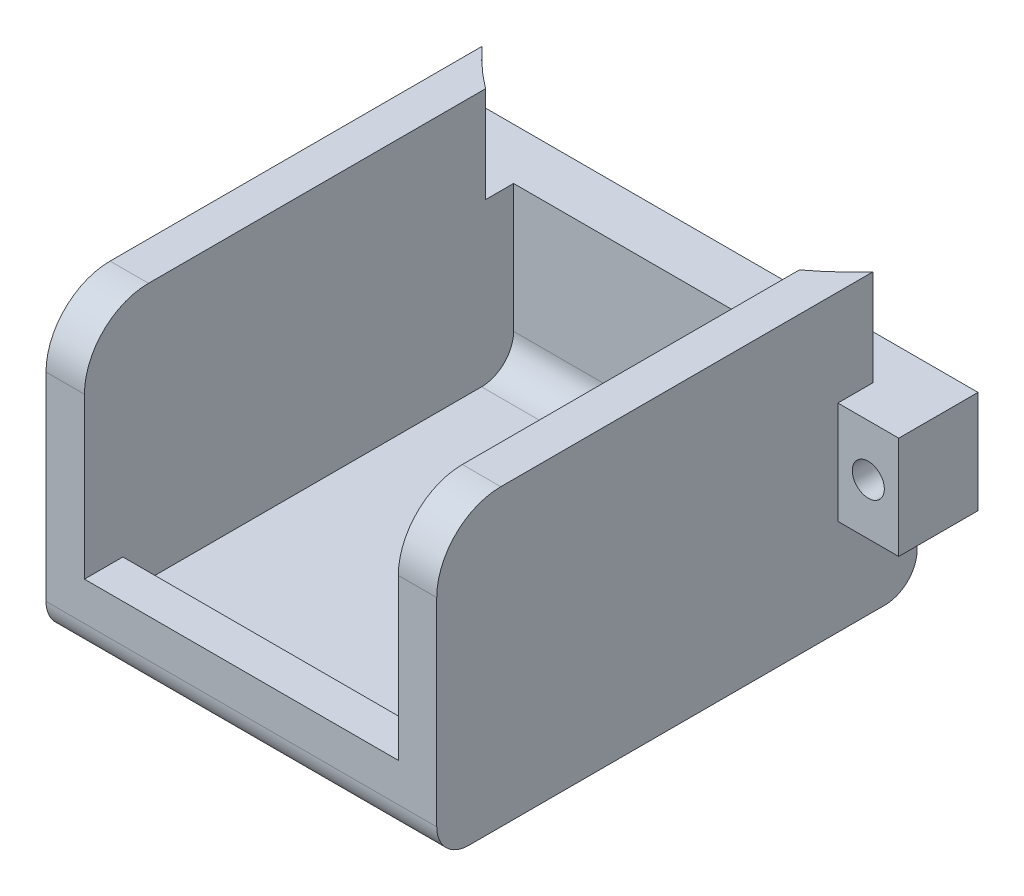
ISO-10303-21;
HEADER;
FILE_DESCRIPTION(('STEP AP214'),'2;1');
FILE_NAME('part.step','',(''),(''),'','','');
FILE_SCHEMA(('AUTOMOTIVE_DESIGN { 1 0 10303 214 1 1 1 1 }'));
ENDSEC;
DATA;
#1=APPLICATION_CONTEXT('core data for automotive mechanical design processes');
#2=APPLICATION_PROTOCOL_DEFINITION('international standard','automotive_design',2000,#1);
#3=PRODUCT_CONTEXT('',#1,'mechanical');
#4=PRODUCT('Part','Part','',(#3));
#5=PRODUCT_RELATED_PRODUCT_CATEGORY('part','',(#4));
#6=PRODUCT_DEFINITION_FORMATION('','',#4);
#7=PRODUCT_DEFINITION_CONTEXT('part definition',#1,'design');
#8=PRODUCT_DEFINITION('design','',#6,#7);
#9=PRODUCT_DEFINITION_SHAPE('','',#8);
#10=(LENGTH_UNIT() NAMED_UNIT(*) SI_UNIT(.MILLI.,.METRE.));
#11=(NAMED_UNIT(*) PLANE_ANGLE_UNIT() SI_UNIT($,.RADIAN.));
#12=(NAMED_UNIT(*) SI_UNIT($,.STERADIAN.) SOLID_ANGLE_UNIT());
#13=UNCERTAINTY_MEASURE_WITH_UNIT(LENGTH_MEASURE(1.E-05),#10,'distance_accuracy_value','');
#14=(GEOMETRIC_REPRESENTATION_CONTEXT(3) GLOBAL_UNCERTAINTY_ASSIGNED_CONTEXT((#13)) GLOBAL_UNIT_ASSIGNED_CONTEXT((#10,
#11,#12)) REPRESENTATION_CONTEXT('',''));
#15=CARTESIAN_POINT('',(0.,0.,0.));
#16=DIRECTION('',(0.,0.,1.));
#17=DIRECTION('',(1.,0.,0.));
#18=AXIS2_PLACEMENT_3D('',#15,#16,#17);
#19=CARTESIAN_POINT('',(0.,0.,0.));
#20=DIRECTION('',(0.,1.,0.));
#21=DIRECTION('',(0.,0.,1.));
#22=AXIS2_PLACEMENT_3D('',#19,#20,#21);
#23=PLANE('',#22);
#24=DIRECTION('',(0.,0.,-1.));
#25=VECTOR('',#24,1.);
#26=CARTESIAN_POINT('',(-40.,0.,0.));
#27=LINE('',#26,#25);
#28=CARTESIAN_POINT('',(-40.,0.,32.8747623565555));
#29=VERTEX_POINT('',#28);
#30=CARTESIAN_POINT('',(-40.,0.,20.5));
#31=VERTEX_POINT('',#30);
#32=EDGE_CURVE('E239',#29,#31,#27,.T.);
#33=ORIENTED_EDGE('',*,*,#32,.T.);
#34=DIRECTION('',(1.,0.,0.));
#35=VECTOR('',#34,1.);
#36=CARTESIAN_POINT('',(0.,0.,20.5));
#37=LINE('',#36,#35);
#38=CARTESIAN_POINT('',(-30.5,0.,20.5));
#39=VERTEX_POINT('',#38);
#40=EDGE_CURVE('E51',#31,#39,#37,.T.);
#41=ORIENTED_EDGE('',*,*,#40,.T.);
#42=DIRECTION('',(0.,0.,1.));
#43=VECTOR('',#42,1.);
#44=CARTESIAN_POINT('',(-30.5,0.,0.));
#45=LINE('',#44,#43);
#46=CARTESIAN_POINT('',(-30.5,0.,32.8747623565555));
#47=VERTEX_POINT('',#46);
#48=EDGE_CURVE('E322',#39,#47,#45,.T.);
#49=ORIENTED_EDGE('',*,*,#48,.T.);
#50=DIRECTION('',(-1.,0.,0.));
#51=VECTOR('',#50,1.);
#52=CARTESIAN_POINT('',(-24.5,0.,32.8747623565555));
#53=LINE('',#52,#51);
#54=EDGE_CURVE('E397',#47,#29,#53,.T.);
#55=ORIENTED_EDGE('',*,*,#54,.T.);
#56=EDGE_LOOP('',(#33,#41,#49,#55));
#57=FACE_BOUND('',#56,.T.);
#58=ADVANCED_FACE('F35',(#57),#23,.F.);
#59=CARTESIAN_POINT('',(30.5,31.,95.5));
#60=DIRECTION('',(1.,0.,0.));
#61=DIRECTION('',(0.,0.,-1.));
#62=AXIS2_PLACEMENT_3D('',#59,#60,#61);
#63=PLANE('',#62);
#64=DIRECTION('',(0.,-1.,0.));
#65=VECTOR('',#64,1.);
#66=CARTESIAN_POINT('',(30.5,31.,32.8747623565555));
#67=LINE('',#66,#65);
#68=CARTESIAN_POINT('',(30.5,16.,32.8747623565555));
#69=VERTEX_POINT('',#68);
#70=CARTESIAN_POINT('',(30.5,0.,32.8747623565555));
#71=VERTEX_POINT('',#70);
#72=EDGE_CURVE('E248',#69,#71,#67,.T.);
#73=ORIENTED_EDGE('',*,*,#72,.F.);
#74=DIRECTION('',(0.,0.,-1.));
#75=VECTOR('',#74,1.);
#76=CARTESIAN_POINT('',(30.5,16.,95.5));
#77=LINE('',#76,#75);
#78=CARTESIAN_POINT('',(30.5,16.,27.3998175176405));
#79=VERTEX_POINT('',#78);
#80=EDGE_CURVE('E243',#69,#79,#77,.T.);
#81=ORIENTED_EDGE('',*,*,#80,.T.);
#82=DIRECTION('',(0.,-1.,0.));
#83=VECTOR('',#82,1.);
#84=CARTESIAN_POINT('',(30.5,31.001,27.3998175176405));
#85=LINE('',#84,#83);
#86=CARTESIAN_POINT('',(30.5,31.,27.3998175176405));
#87=VERTEX_POINT('',#86);
#88=EDGE_CURVE('E259',#87,#79,#85,.T.);
#89=ORIENTED_EDGE('',*,*,#88,.F.);
#90=DIRECTION('',(0.,0.,-1.));
#91=VECTOR('',#90,1.);
#92=CARTESIAN_POINT('',(30.5,31.,95.5));
#93=LINE('',#92,#91);
#94=CARTESIAN_POINT('',(30.5,31.,85.5));
#95=VERTEX_POINT('',#94);
#96=EDGE_CURVE('E319',#95,#87,#93,.T.);
#97=ORIENTED_EDGE('',*,*,#96,.F.);
#98=CARTESIAN_POINT('',(30.5,21.,85.5));
#99=DIRECTION('',(1.,0.,0.));
#100=DIRECTION('',(0.,0.,-1.));
#101=AXIS2_PLACEMENT_3D('',#98,#99,#100);
#102=CIRCLE('',#101,10.);
#103=CARTESIAN_POINT('',(30.5,21.,95.5));
#104=VERTEX_POINT('',#103);
#105=EDGE_CURVE('E341',#95,#104,#102,.T.);
#106=ORIENTED_EDGE('',*,*,#105,.T.);
#107=DIRECTION('',(0.,-1.,0.));
#108=VECTOR('',#107,1.);
#109=CARTESIAN_POINT('',(30.5,31.,95.5));
#110=LINE('',#109,#108);
#111=CARTESIAN_POINT('',(30.5,-9.99999999999999,95.5));
#112=VERTEX_POINT('',#111);
#113=EDGE_CURVE('E309',#104,#112,#110,.T.);
#114=ORIENTED_EDGE('',*,*,#113,.T.);
#115=CARTESIAN_POINT('',(30.5,-10.,90.5));
#116=DIRECTION('',(1.,0.,0.));
#117=DIRECTION('',(0.,0.,-1.));
#118=AXIS2_PLACEMENT_3D('',#115,#116,#117);
#119=CIRCLE('',#118,5.);
#120=CARTESIAN_POINT('',(30.5,-15.,90.5));
#121=VERTEX_POINT('',#120);
#122=EDGE_CURVE('E381',#112,#121,#119,.T.);
#123=ORIENTED_EDGE('',*,*,#122,.T.);
#124=DIRECTION('',(0.,0.,-1.));
#125=VECTOR('',#124,1.);
#126=CARTESIAN_POINT('',(30.5,-15.,95.5));
#127=LINE('',#126,#125);
#128=CARTESIAN_POINT('',(30.5,-15.,25.5));
#129=VERTEX_POINT('',#128);
#130=EDGE_CURVE('E315',#121,#129,#127,.T.);
#131=ORIENTED_EDGE('',*,*,#130,.T.);
#132=CARTESIAN_POINT('',(30.5,-10.,25.5));
#133=DIRECTION('',(1.,0.,0.));
#134=DIRECTION('',(0.,0.,-1.));
#135=AXIS2_PLACEMENT_3D('',#132,#133,#134);
#136=CIRCLE('',#135,5.);
#137=CARTESIAN_POINT('',(30.5,-9.99999999999999,20.5));
#138=VERTEX_POINT('',#137);
#139=EDGE_CURVE('E379',#129,#138,#136,.T.);
#140=ORIENTED_EDGE('',*,*,#139,.T.);
#141=DIRECTION('',(0.,-1.,0.));
#142=VECTOR('',#141,1.);
#143=CARTESIAN_POINT('',(30.5,31.,20.5));
#144=LINE('',#143,#142);
#145=CARTESIAN_POINT('',(30.5,0.,20.5));
#146=VERTEX_POINT('',#145);
#147=EDGE_CURVE('E302',#146,#138,#144,.T.);
#148=ORIENTED_EDGE('',*,*,#147,.F.);
#149=DIRECTION('',(0.,0.,-1.));
#150=VECTOR('',#149,1.);
#151=CARTESIAN_POINT('',(30.5,0.,0.));
#152=LINE('',#151,#150);
#153=EDGE_CURVE('E332',#71,#146,#152,.T.);
#154=ORIENTED_EDGE('',*,*,#153,.F.);
#155=EDGE_LOOP('',(#73,#81,#89,#97,#106,#114,#123,#131,#140,#148,#154));
#156=FACE_BOUND('',#155,.T.);
#157=ADVANCED_FACE('F421',(#156),#63,.T.);
#158=CARTESIAN_POINT('',(-30.5,31.,95.5));
#159=DIRECTION('',(-1.,0.,0.));
#160=DIRECTION('',(0.,0.,1.));
#161=AXIS2_PLACEMENT_3D('',#158,#159,#160);
#162=PLANE('',#161);
#163=DIRECTION('',(0.,-1.,0.));
#164=VECTOR('',#163,1.);
#165=CARTESIAN_POINT('',(-30.5,31.001,27.3998175176405));
#166=LINE('',#165,#164);
#167=CARTESIAN_POINT('',(-30.5,16.,27.3998175176405));
#168=VERTEX_POINT('',#167);
#169=CARTESIAN_POINT('',(-30.5,31.,27.3998175176405));
#170=VERTEX_POINT('',#169);
#171=EDGE_CURVE('E257',#168,#170,#166,.F.);
#172=ORIENTED_EDGE('',*,*,#171,.F.);
#173=DIRECTION('',(0.,0.,1.));
#174=VECTOR('',#173,1.);
#175=CARTESIAN_POINT('',(-30.5,16.,95.5));
#176=LINE('',#175,#174);
#177=CARTESIAN_POINT('',(-30.5,16.,32.8747623565555));
#178=VERTEX_POINT('',#177);
#179=EDGE_CURVE('E241',#168,#178,#176,.T.);
#180=ORIENTED_EDGE('',*,*,#179,.T.);
#181=DIRECTION('',(0.,1.,0.));
#182=VECTOR('',#181,1.);
#183=CARTESIAN_POINT('',(-30.5,31.,32.8747623565555));
#184=LINE('',#183,#182);
#185=EDGE_CURVE('E245',#47,#178,#184,.T.);
#186=ORIENTED_EDGE('',*,*,#185,.F.);
#187=ORIENTED_EDGE('',*,*,#48,.F.);
#188=DIRECTION('',(0.,1.,0.));
#189=VECTOR('',#188,1.);
#190=CARTESIAN_POINT('',(-30.5,31.,20.5));
#191=LINE('',#190,#189);
#192=CARTESIAN_POINT('',(-30.5,-9.99999999999999,20.5));
#193=VERTEX_POINT('',#192);
#194=EDGE_CURVE('E313',#193,#39,#191,.T.);
#195=ORIENTED_EDGE('',*,*,#194,.F.);
#196=CARTESIAN_POINT('',(-30.5,-10.,25.5));
#197=DIRECTION('',(-1.,0.,0.));
#198=DIRECTION('',(0.,0.,1.));
#199=AXIS2_PLACEMENT_3D('',#196,#197,#198);
#200=CIRCLE('',#199,5.);
#201=CARTESIAN_POINT('',(-30.5,-15.,25.5));
#202=VERTEX_POINT('',#201);
#203=EDGE_CURVE('E373',#193,#202,#200,.T.);
#204=ORIENTED_EDGE('',*,*,#203,.T.);
#205=DIRECTION('',(0.,0.,-1.));
#206=VECTOR('',#205,1.);
#207=CARTESIAN_POINT('',(-30.5,-15.,95.5));
#208=LINE('',#207,#206);
#209=CARTESIAN_POINT('',(-30.5,-15.,90.5));
#210=VERTEX_POINT('',#209);
#211=EDGE_CURVE('E326',#210,#202,#208,.T.);
#212=ORIENTED_EDGE('',*,*,#211,.F.);
#213=CARTESIAN_POINT('',(-30.5,-10.,90.5));
#214=DIRECTION('',(-1.,0.,0.));
#215=DIRECTION('',(0.,0.,1.));
#216=AXIS2_PLACEMENT_3D('',#213,#214,#215);
#217=CIRCLE('',#216,5.);
#218=CARTESIAN_POINT('',(-30.5,-9.99999999999999,95.5));
#219=VERTEX_POINT('',#218);
#220=EDGE_CURVE('E375',#210,#219,#217,.T.);
#221=ORIENTED_EDGE('',*,*,#220,.T.);
#222=DIRECTION('',(0.,1.,0.));
#223=VECTOR('',#222,1.);
#224=CARTESIAN_POINT('',(-30.5,31.,95.5));
#225=LINE('',#224,#223);
#226=CARTESIAN_POINT('',(-30.5,21.,95.5));
#227=VERTEX_POINT('',#226);
#228=EDGE_CURVE('E312',#219,#227,#225,.T.);
#229=ORIENTED_EDGE('',*,*,#228,.T.);
#230=CARTESIAN_POINT('',(-30.5,21.,85.5));
#231=DIRECTION('',(-1.,0.,0.));
#232=DIRECTION('',(0.,0.,1.));
#233=AXIS2_PLACEMENT_3D('',#230,#231,#232);
#234=CIRCLE('',#233,10.);
#235=CARTESIAN_POINT('',(-30.5,31.,85.5));
#236=VERTEX_POINT('',#235);
#237=EDGE_CURVE('E352',#227,#236,#234,.T.);
#238=ORIENTED_EDGE('',*,*,#237,.T.);
#239=DIRECTION('',(0.,0.,-1.));
#240=VECTOR('',#239,1.);
#241=CARTESIAN_POINT('',(-30.5,31.,95.5));
#242=LINE('',#241,#240);
#243=EDGE_CURVE('E323',#236,#170,#242,.T.);
#244=ORIENTED_EDGE('',*,*,#243,.T.);
#245=EDGE_LOOP('',(#172,#180,#186,#187,#195,#204,#212,#221,#229,#238,#244));
#246=FACE_BOUND('',#245,.T.);
#247=ADVANCED_FACE('F392',(#246),#162,.T.);
#248=CARTESIAN_POINT('',(20.5,0.,20.5));
#249=DIRECTION('',(0.,0.,1.));
#250=DIRECTION('',(1.,0.,0.));
#251=AXIS2_PLACEMENT_3D('',#248,#249,#250);
#252=PLANE('',#251);
#253=ORIENTED_EDGE('',*,*,#194,.T.);
#254=ORIENTED_EDGE('',*,*,#40,.F.);
#255=DIRECTION('',(0.,-1.,0.));
#256=VECTOR('',#255,1.);
#257=CARTESIAN_POINT('',(-40.,31.,20.5));
#258=LINE('',#257,#256);
#259=CARTESIAN_POINT('',(-40.,16.,20.5));
#260=VERTEX_POINT('',#259);
#261=EDGE_CURVE('E210',#260,#31,#258,.T.);
#262=ORIENTED_EDGE('',*,*,#261,.F.);
#263=DIRECTION('',(1.,0.,0.));
#264=VECTOR('',#263,1.);
#265=CARTESIAN_POINT('',(0.,16.,20.5));
#266=LINE('',#265,#264);
#267=CARTESIAN_POINT('',(40.,16.,20.5));
#268=VERTEX_POINT('',#267);
#269=EDGE_CURVE('E57',#260,#268,#266,.T.);
#270=ORIENTED_EDGE('',*,*,#269,.T.);
#271=DIRECTION('',(0.,-1.,0.));
#272=VECTOR('',#271,1.);
#273=CARTESIAN_POINT('',(40.,31.,20.5));
#274=LINE('',#273,#272);
#275=CARTESIAN_POINT('',(40.,0.,20.5));
#276=VERTEX_POINT('',#275);
#277=EDGE_CURVE('E216',#268,#276,#274,.T.);
#278=ORIENTED_EDGE('',*,*,#277,.T.);
#279=EDGE_CURVE('E398',#146,#276,#37,.T.);
#280=ORIENTED_EDGE('',*,*,#279,.F.);
#281=ORIENTED_EDGE('',*,*,#147,.T.);
#282=DIRECTION('',(-1.,0.,0.));
#283=VECTOR('',#282,1.);
#284=CARTESIAN_POINT('',(-30.5,-10.,20.5));
#285=LINE('',#284,#283);
#286=EDGE_CURVE('E44',#138,#193,#285,.T.);
#287=ORIENTED_EDGE('',*,*,#286,.T.);
#288=EDGE_LOOP('',(#253,#254,#262,#270,#278,#280,#281,#287));
#289=FACE_BOUND('',#288,.T.);
#290=CARTESIAN_POINT('',(-35.25,8.,20.5));
#291=DIRECTION('',(0.,0.,1.));
#292=DIRECTION('',(1.,0.,0.));
#293=AXIS2_PLACEMENT_3D('',#290,#291,#292);
#294=CIRCLE('',#293,2.49999999999999);
#295=CARTESIAN_POINT('',(-32.75,8.,20.5));
#296=VERTEX_POINT('',#295);
#297=EDGE_CURVE('E39',#296,#296,#294,.F.);
#298=ORIENTED_EDGE('',*,*,#297,.F.);
#299=EDGE_LOOP('',(#298));
#300=FACE_BOUND('',#299,.T.);
#301=CARTESIAN_POINT('',(35.25,8.,20.5));
#302=DIRECTION('',(0.,0.,1.));
#303=DIRECTION('',(1.,0.,0.));
#304=AXIS2_PLACEMENT_3D('',#301,#302,#303);
#305=CIRCLE('',#304,2.49999999999999);
#306=CARTESIAN_POINT('',(37.75,8.,20.5));
#307=VERTEX_POINT('',#306);
#308=EDGE_CURVE('E403',#307,#307,#305,.F.);
#309=ORIENTED_EDGE('',*,*,#308,.F.);
#310=EDGE_LOOP('',(#309));
#311=FACE_BOUND('',#310,.T.);
#312=ADVANCED_FACE('F211',(#289,#300,#311),#252,.F.);
#313=CARTESIAN_POINT('',(30.5,31.,95.5));
#314=DIRECTION('',(0.,1.,0.));
#315=DIRECTION('',(0.,0.,1.));
#316=AXIS2_PLACEMENT_3D('',#313,#314,#315);
#317=PLANE('',#316);
#318=ORIENTED_EDGE('',*,*,#96,.T.);
#319=CARTESIAN_POINT('',(0.,31.,0.));
#320=DIRECTION('',(0.,1.,0.));
#321=DIRECTION('',(0.,0.,1.));
#322=AXIS2_PLACEMENT_3D('',#319,#320,#321);
#323=CIRCLE('',#322,41.);
#324=CARTESIAN_POINT('',(24.5,31.,32.8747623565555));
#325=VERTEX_POINT('',#324);
#326=EDGE_CURVE('E275',#325,#87,#323,.T.);
#327=ORIENTED_EDGE('',*,*,#326,.F.);
#328=DIRECTION('',(0.,0.,-1.));
#329=VECTOR('',#328,1.);
#330=CARTESIAN_POINT('',(24.5,31.,95.5));
#331=LINE('',#330,#329);
#332=CARTESIAN_POINT('',(24.5,31.,85.5));
#333=VERTEX_POINT('',#332);
#334=EDGE_CURVE('E283',#333,#325,#331,.T.);
#335=ORIENTED_EDGE('',*,*,#334,.F.);
#336=DIRECTION('',(1.,0.,0.));
#337=VECTOR('',#336,1.);
#338=CARTESIAN_POINT('',(30.5,31.,85.5));
#339=LINE('',#338,#337);
#340=EDGE_CURVE('E338',#333,#95,#339,.T.);
#341=ORIENTED_EDGE('',*,*,#340,.T.);
#342=EDGE_LOOP('',(#318,#327,#335,#341));
#343=FACE_BOUND('',#342,.T.);
#344=ADVANCED_FACE('F450',(#343),#317,.T.);
#345=DIRECTION('',(0.,0.,1.));
#346=VECTOR('',#345,1.);
#347=CARTESIAN_POINT('',(-24.5,31.,95.5));
#348=LINE('',#347,#346);
#349=CARTESIAN_POINT('',(-24.5,31.,32.8747623565555));
#350=VERTEX_POINT('',#349);
#351=CARTESIAN_POINT('',(-24.5,31.,85.5));
#352=VERTEX_POINT('',#351);
#353=EDGE_CURVE('E290',#350,#352,#348,.T.);
#354=ORIENTED_EDGE('',*,*,#353,.F.);
#355=EDGE_CURVE('E207',#170,#350,#323,.T.);
#356=ORIENTED_EDGE('',*,*,#355,.F.);
#357=ORIENTED_EDGE('',*,*,#243,.F.);
#358=DIRECTION('',(1.,0.,0.));
#359=VECTOR('',#358,1.);
#360=CARTESIAN_POINT('',(-24.5,31.,85.5));
#361=LINE('',#360,#359);
#362=EDGE_CURVE('E335',#236,#352,#361,.T.);
#363=ORIENTED_EDGE('',*,*,#362,.T.);
#364=EDGE_LOOP('',(#354,#356,#357,#363));
#365=FACE_BOUND('',#364,.T.);
#366=ADVANCED_FACE('F487',(#365),#317,.T.);
#367=CARTESIAN_POINT('',(24.5,-4.,95.5));
#368=DIRECTION('',(1.,0.,0.));
#369=DIRECTION('',(0.,0.,-1.));
#370=AXIS2_PLACEMENT_3D('',#367,#368,#369);
#371=PLANE('',#370);
#372=DIRECTION('',(0.,-1.,0.));
#373=VECTOR('',#372,1.);
#374=CARTESIAN_POINT('',(24.5,31.001,32.8747623565555));
#375=LINE('',#374,#373);
#376=CARTESIAN_POINT('',(24.5,16.,32.8747623565555));
#377=VERTEX_POINT('',#376);
#378=EDGE_CURVE('E254',#325,#377,#375,.T.);
#379=ORIENTED_EDGE('',*,*,#378,.T.);
#380=DIRECTION('',(0.,0.,-1.));
#381=VECTOR('',#380,1.);
#382=CARTESIAN_POINT('',(24.5,16.,0.));
#383=LINE('',#382,#381);
#384=CARTESIAN_POINT('',(24.5,16.,28.5));
#385=VERTEX_POINT('',#384);
#386=EDGE_CURVE('E208',#377,#385,#383,.T.);
#387=ORIENTED_EDGE('',*,*,#386,.T.);
#388=DIRECTION('',(0.,1.,0.));
#389=VECTOR('',#388,1.);
#390=CARTESIAN_POINT('',(24.5,-4.,28.5));
#391=LINE('',#390,#389);
#392=CARTESIAN_POINT('',(24.5,-4.,28.5));
#393=VERTEX_POINT('',#392);
#394=EDGE_CURVE('E295',#393,#385,#391,.T.);
#395=ORIENTED_EDGE('',*,*,#394,.F.);
#396=CARTESIAN_POINT('',(24.5,-4.,33.5));
#397=DIRECTION('',(1.,0.,0.));
#398=DIRECTION('',(0.,0.,-1.));
#399=AXIS2_PLACEMENT_3D('',#396,#397,#398);
#400=CIRCLE('',#399,5.);
#401=CARTESIAN_POINT('',(24.5,-9.00000000000001,33.5));
#402=VERTEX_POINT('',#401);
#403=EDGE_CURVE('E360',#393,#402,#400,.F.);
#404=ORIENTED_EDGE('',*,*,#403,.T.);
#405=DIRECTION('',(0.,0.,-1.));
#406=VECTOR('',#405,1.);
#407=CARTESIAN_POINT('',(24.5,-9.00000000000001,28.5));
#408=LINE('',#407,#406);
#409=CARTESIAN_POINT('',(24.5,-9.00000000000001,84.5));
#410=VERTEX_POINT('',#409);
#411=EDGE_CURVE('E279',#410,#402,#408,.T.);
#412=ORIENTED_EDGE('',*,*,#411,.F.);
#413=CARTESIAN_POINT('',(24.5,-4.,84.5));
#414=DIRECTION('',(1.,0.,0.));
#415=DIRECTION('',(0.,0.,-1.));
#416=AXIS2_PLACEMENT_3D('',#413,#414,#415);
#417=CIRCLE('',#416,5.);
#418=CARTESIAN_POINT('',(24.5,-4.,89.5));
#419=VERTEX_POINT('',#418);
#420=EDGE_CURVE('E362',#410,#419,#417,.F.);
#421=ORIENTED_EDGE('',*,*,#420,.T.);
#422=DIRECTION('',(0.,0.,-1.));
#423=VECTOR('',#422,1.);
#424=CARTESIAN_POINT('',(24.5,-4.,95.5));
#425=LINE('',#424,#423);
#426=CARTESIAN_POINT('',(24.5,-4.,95.5));
#427=VERTEX_POINT('',#426);
#428=EDGE_CURVE('E286',#427,#419,#425,.T.);
#429=ORIENTED_EDGE('',*,*,#428,.F.);
#430=DIRECTION('',(0.,1.,0.));
#431=VECTOR('',#430,1.);
#432=CARTESIAN_POINT('',(24.5,-4.,95.5));
#433=LINE('',#432,#431);
#434=CARTESIAN_POINT('',(24.5,21.,95.5));
#435=VERTEX_POINT('',#434);
#436=EDGE_CURVE('E299',#427,#435,#433,.T.);
#437=ORIENTED_EDGE('',*,*,#436,.T.);
#438=CARTESIAN_POINT('',(24.5,21.,85.5));
#439=DIRECTION('',(1.,0.,0.));
#440=DIRECTION('',(0.,0.,-1.));
#441=AXIS2_PLACEMENT_3D('',#438,#439,#440);
#442=CIRCLE('',#441,10.);
#443=EDGE_CURVE('E348',#435,#333,#442,.F.);
#444=ORIENTED_EDGE('',*,*,#443,.T.);
#445=ORIENTED_EDGE('',*,*,#334,.T.);
#446=EDGE_LOOP('',(#379,#387,#395,#404,#412,#421,#429,#437,#444,#445));
#447=FACE_BOUND('',#446,.T.);
#448=ADVANCED_FACE('F447',(#447),#371,.F.);
#449=CARTESIAN_POINT('',(-24.5,-4.,95.5));
#450=DIRECTION('',(-1.,0.,0.));
#451=DIRECTION('',(0.,0.,1.));
#452=AXIS2_PLACEMENT_3D('',#449,#450,#451);
#453=PLANE('',#452);
#454=DIRECTION('',(0.,0.,1.));
#455=VECTOR('',#454,1.);
#456=CARTESIAN_POINT('',(-24.5,16.,0.));
#457=LINE('',#456,#455);
#458=CARTESIAN_POINT('',(-24.5,16.,28.5));
#459=VERTEX_POINT('',#458);
#460=CARTESIAN_POINT('',(-24.5,16.,32.8747623565555));
#461=VERTEX_POINT('',#460);
#462=EDGE_CURVE('E269',#459,#461,#457,.T.);
#463=ORIENTED_EDGE('',*,*,#462,.T.);
#464=DIRECTION('',(0.,-1.,0.));
#465=VECTOR('',#464,1.);
#466=CARTESIAN_POINT('',(-24.5,31.001,32.8747623565555));
#467=LINE('',#466,#465);
#468=EDGE_CURVE('E251',#461,#350,#467,.F.);
#469=ORIENTED_EDGE('',*,*,#468,.T.);
#470=ORIENTED_EDGE('',*,*,#353,.T.);
#471=CARTESIAN_POINT('',(-24.5,21.,85.5));
#472=DIRECTION('',(-1.,0.,0.));
#473=DIRECTION('',(0.,0.,1.));
#474=AXIS2_PLACEMENT_3D('',#471,#472,#473);
#475=CIRCLE('',#474,10.);
#476=CARTESIAN_POINT('',(-24.5,21.,95.5));
#477=VERTEX_POINT('',#476);
#478=EDGE_CURVE('E350',#352,#477,#475,.F.);
#479=ORIENTED_EDGE('',*,*,#478,.T.);
#480=DIRECTION('',(0.,1.,0.));
#481=VECTOR('',#480,1.);
#482=CARTESIAN_POINT('',(-24.5,-4.,95.5));
#483=LINE('',#482,#481);
#484=CARTESIAN_POINT('',(-24.5,-4.,95.5));
#485=VERTEX_POINT('',#484);
#486=EDGE_CURVE('E303',#485,#477,#483,.T.);
#487=ORIENTED_EDGE('',*,*,#486,.F.);
#488=DIRECTION('',(0.,0.,1.));
#489=VECTOR('',#488,1.);
#490=CARTESIAN_POINT('',(-24.5,-4.,95.5));
#491=LINE('',#490,#489);
#492=CARTESIAN_POINT('',(-24.5,-4.,89.5));
#493=VERTEX_POINT('',#492);
#494=EDGE_CURVE('E289',#493,#485,#491,.T.);
#495=ORIENTED_EDGE('',*,*,#494,.F.);
#496=CARTESIAN_POINT('',(-24.5,-4.,84.5));
#497=DIRECTION('',(-1.,0.,0.));
#498=DIRECTION('',(0.,0.,1.));
#499=AXIS2_PLACEMENT_3D('',#496,#497,#498);
#500=CIRCLE('',#499,5.);
#501=CARTESIAN_POINT('',(-24.5,-9.00000000000001,84.5));
#502=VERTEX_POINT('',#501);
#503=EDGE_CURVE('E366',#493,#502,#500,.F.);
#504=ORIENTED_EDGE('',*,*,#503,.T.);
#505=DIRECTION('',(0.,0.,1.));
#506=VECTOR('',#505,1.);
#507=CARTESIAN_POINT('',(-24.5,-9.00000000000001,28.5));
#508=LINE('',#507,#506);
#509=CARTESIAN_POINT('',(-24.5,-9.00000000000001,33.5));
#510=VERTEX_POINT('',#509);
#511=EDGE_CURVE('E276',#510,#502,#508,.T.);
#512=ORIENTED_EDGE('',*,*,#511,.F.);
#513=CARTESIAN_POINT('',(-24.5,-4.,33.5));
#514=DIRECTION('',(-1.,0.,0.));
#515=DIRECTION('',(0.,0.,1.));
#516=AXIS2_PLACEMENT_3D('',#513,#514,#515);
#517=CIRCLE('',#516,5.);
#518=CARTESIAN_POINT('',(-24.5,-4.,28.5));
#519=VERTEX_POINT('',#518);
#520=EDGE_CURVE('E364',#510,#519,#517,.F.);
#521=ORIENTED_EDGE('',*,*,#520,.T.);
#522=DIRECTION('',(0.,1.,0.));
#523=VECTOR('',#522,1.);
#524=CARTESIAN_POINT('',(-24.5,-4.,28.5));
#525=LINE('',#524,#523);
#526=EDGE_CURVE('E306',#519,#459,#525,.T.);
#527=ORIENTED_EDGE('',*,*,#526,.T.);
#528=EDGE_LOOP('',(#463,#469,#470,#479,#487,#495,#504,#512,#521,#527));
#529=FACE_BOUND('',#528,.T.);
#530=ADVANCED_FACE('F469',(#529),#453,.F.);
#531=CARTESIAN_POINT('',(24.5,-4.,28.5));
#532=DIRECTION('',(0.,0.,-1.));
#533=DIRECTION('',(-1.,0.,0.));
#534=AXIS2_PLACEMENT_3D('',#531,#532,#533);
#535=PLANE('',#534);
#536=DIRECTION('',(-1.,0.,0.));
#537=VECTOR('',#536,1.);
#538=CARTESIAN_POINT('',(0.,16.,28.5));
#539=LINE('',#538,#537);
#540=EDGE_CURVE('E266',#385,#459,#539,.T.);
#541=ORIENTED_EDGE('',*,*,#540,.T.);
#542=ORIENTED_EDGE('',*,*,#526,.F.);
#543=DIRECTION('',(-1.,0.,0.));
#544=VECTOR('',#543,1.);
#545=CARTESIAN_POINT('',(24.5,-4.,28.5));
#546=LINE('',#545,#544);
#547=EDGE_CURVE('E11',#519,#393,#546,.F.);
#548=ORIENTED_EDGE('',*,*,#547,.T.);
#549=ORIENTED_EDGE('',*,*,#394,.T.);
#550=EDGE_LOOP('',(#541,#542,#548,#549));
#551=FACE_BOUND('',#550,.T.);
#552=ADVANCED_FACE('F493',(#551),#535,.F.);
#553=CARTESIAN_POINT('',(0.,16.,0.));
#554=DIRECTION('',(0.,1.,0.));
#555=DIRECTION('',(0.,0.,1.));
#556=AXIS2_PLACEMENT_3D('',#553,#554,#555);
#557=PLANE('',#556);
#558=ORIENTED_EDGE('',*,*,#269,.F.);
#559=DIRECTION('',(0.,0.,1.));
#560=VECTOR('',#559,1.);
#561=CARTESIAN_POINT('',(-40.,16.,0.));
#562=LINE('',#561,#560);
#563=CARTESIAN_POINT('',(-40.,16.,32.8747623565555));
#564=VERTEX_POINT('',#563);
#565=EDGE_CURVE('E203',#260,#564,#562,.T.);
#566=ORIENTED_EDGE('',*,*,#565,.T.);
#567=DIRECTION('',(1.,0.,0.));
#568=VECTOR('',#567,1.);
#569=CARTESIAN_POINT('',(-24.5,16.,32.8747623565555));
#570=LINE('',#569,#568);
#571=EDGE_CURVE('E222',#564,#178,#570,.T.);
#572=ORIENTED_EDGE('',*,*,#571,.T.);
#573=ORIENTED_EDGE('',*,*,#179,.F.);
#574=CARTESIAN_POINT('',(0.,16.,0.));
#575=DIRECTION('',(0.,1.,0.));
#576=DIRECTION('',(0.,0.,1.));
#577=AXIS2_PLACEMENT_3D('',#574,#575,#576);
#578=CIRCLE('',#577,41.);
#579=EDGE_CURVE('E262',#168,#461,#578,.T.);
#580=ORIENTED_EDGE('',*,*,#579,.T.);
#581=ORIENTED_EDGE('',*,*,#462,.F.);
#582=ORIENTED_EDGE('',*,*,#540,.F.);
#583=ORIENTED_EDGE('',*,*,#386,.F.);
#584=EDGE_CURVE('E263',#377,#79,#578,.T.);
#585=ORIENTED_EDGE('',*,*,#584,.T.);
#586=ORIENTED_EDGE('',*,*,#80,.F.);
#587=DIRECTION('',(1.,0.,0.));
#588=VECTOR('',#587,1.);
#589=CARTESIAN_POINT('',(40.,16.,32.8747623565555));
#590=LINE('',#589,#588);
#591=CARTESIAN_POINT('',(40.,16.,32.8747623565555));
#592=VERTEX_POINT('',#591);
#593=EDGE_CURVE('E225',#69,#592,#590,.T.);
#594=ORIENTED_EDGE('',*,*,#593,.T.);
#595=DIRECTION('',(0.,0.,-1.));
#596=VECTOR('',#595,1.);
#597=CARTESIAN_POINT('',(40.,16.,0.));
#598=LINE('',#597,#596);
#599=EDGE_CURVE('E206',#592,#268,#598,.T.);
#600=ORIENTED_EDGE('',*,*,#599,.T.);
#601=EDGE_LOOP('',(#558,#566,#572,#573,#580,#581,#582,#583,#585,#586,#594,#600));
#602=FACE_BOUND('',#601,.T.);
#603=ADVANCED_FACE('F200',(#602),#557,.T.);
#604=ORIENTED_EDGE('',*,*,#153,.T.);
#605=ORIENTED_EDGE('',*,*,#279,.T.);
#606=DIRECTION('',(0.,0.,1.));
#607=VECTOR('',#606,1.);
#608=CARTESIAN_POINT('',(40.,0.,0.));
#609=LINE('',#608,#607);
#610=CARTESIAN_POINT('',(40.,0.,32.8747623565555));
#611=VERTEX_POINT('',#610);
#612=EDGE_CURVE('E231',#276,#611,#609,.T.);
#613=ORIENTED_EDGE('',*,*,#612,.T.);
#614=DIRECTION('',(-1.,0.,0.));
#615=VECTOR('',#614,1.);
#616=CARTESIAN_POINT('',(40.,0.,32.8747623565555));
#617=LINE('',#616,#615);
#618=EDGE_CURVE('E407',#611,#71,#617,.T.);
#619=ORIENTED_EDGE('',*,*,#618,.T.);
#620=EDGE_LOOP('',(#604,#605,#613,#619));
#621=FACE_BOUND('',#620,.T.);
#622=ADVANCED_FACE('F412',(#621),#23,.F.);
#623=CARTESIAN_POINT('',(30.5,-15.,95.5));
#624=DIRECTION('',(0.,-1.,0.));
#625=DIRECTION('',(0.,0.,-1.));
#626=AXIS2_PLACEMENT_3D('',#623,#624,#625);
#627=PLANE('',#626);
#628=ORIENTED_EDGE('',*,*,#130,.F.);
#629=DIRECTION('',(-1.,0.,0.));
#630=VECTOR('',#629,1.);
#631=CARTESIAN_POINT('',(-30.5,-15.,90.5));
#632=LINE('',#631,#630);
#633=EDGE_CURVE('E370',#121,#210,#632,.T.);
#634=ORIENTED_EDGE('',*,*,#633,.T.);
#635=ORIENTED_EDGE('',*,*,#211,.T.);
#636=DIRECTION('',(-1.,0.,0.));
#637=VECTOR('',#636,1.);
#638=CARTESIAN_POINT('',(30.5,-15.,25.5));
#639=LINE('',#638,#637);
#640=EDGE_CURVE('E368',#202,#129,#639,.F.);
#641=ORIENTED_EDGE('',*,*,#640,.T.);
#642=EDGE_LOOP('',(#628,#634,#635,#641));
#643=FACE_BOUND('',#642,.T.);
#644=ADVANCED_FACE('F426',(#643),#627,.T.);
#645=CARTESIAN_POINT('',(0.,0.,95.5));
#646=DIRECTION('',(0.,0.,-1.));
#647=DIRECTION('',(-1.,0.,0.));
#648=AXIS2_PLACEMENT_3D('',#645,#646,#647);
#649=PLANE('',#648);
#650=ORIENTED_EDGE('',*,*,#228,.F.);
#651=DIRECTION('',(-1.,0.,0.));
#652=VECTOR('',#651,1.);
#653=CARTESIAN_POINT('',(30.5,-10.,95.5));
#654=LINE('',#653,#652);
#655=EDGE_CURVE('E377',#219,#112,#654,.F.);
#656=ORIENTED_EDGE('',*,*,#655,.T.);
#657=ORIENTED_EDGE('',*,*,#113,.F.);
#658=DIRECTION('',(1.,0.,0.));
#659=VECTOR('',#658,1.);
#660=CARTESIAN_POINT('',(24.5,21.,95.5));
#661=LINE('',#660,#659);
#662=EDGE_CURVE('E346',#104,#435,#661,.F.);
#663=ORIENTED_EDGE('',*,*,#662,.T.);
#664=ORIENTED_EDGE('',*,*,#436,.F.);
#665=DIRECTION('',(1.,0.,0.));
#666=VECTOR('',#665,1.);
#667=CARTESIAN_POINT('',(24.5,-4.,95.5));
#668=LINE('',#667,#666);
#669=EDGE_CURVE('E292',#485,#427,#668,.T.);
#670=ORIENTED_EDGE('',*,*,#669,.F.);
#671=ORIENTED_EDGE('',*,*,#486,.T.);
#672=DIRECTION('',(1.,0.,0.));
#673=VECTOR('',#672,1.);
#674=CARTESIAN_POINT('',(-30.5,21.,95.5));
#675=LINE('',#674,#673);
#676=EDGE_CURVE('E343',#477,#227,#675,.F.);
#677=ORIENTED_EDGE('',*,*,#676,.T.);
#678=EDGE_LOOP('',(#650,#656,#657,#663,#664,#670,#671,#677));
#679=FACE_BOUND('',#678,.T.);
#680=ADVANCED_FACE('F432',(#679),#649,.F.);
#681=CARTESIAN_POINT('',(0.,-4.,0.));
#682=DIRECTION('',(0.,1.,0.));
#683=DIRECTION('',(0.,0.,1.));
#684=AXIS2_PLACEMENT_3D('',#681,#682,#683);
#685=PLANE('',#684);
#686=DIRECTION('',(1.,0.,0.));
#687=VECTOR('',#686,1.);
#688=CARTESIAN_POINT('',(-24.5,-4.,89.5));
#689=LINE('',#688,#687);
#690=EDGE_CURVE('E280',#493,#419,#689,.T.);
#691=ORIENTED_EDGE('',*,*,#690,.F.);
#692=ORIENTED_EDGE('',*,*,#494,.T.);
#693=ORIENTED_EDGE('',*,*,#669,.T.);
#694=ORIENTED_EDGE('',*,*,#428,.T.);
#695=EDGE_LOOP('',(#691,#692,#693,#694));
#696=FACE_BOUND('',#695,.T.);
#697=ADVANCED_FACE('F477',(#696),#685,.T.);
#698=CARTESIAN_POINT('',(0.,-9.00000000000001,0.));
#699=DIRECTION('',(0.,1.,0.));
#700=DIRECTION('',(0.,0.,1.));
#701=AXIS2_PLACEMENT_3D('',#698,#699,#700);
#702=PLANE('',#701);
#703=ORIENTED_EDGE('',*,*,#511,.T.);
#704=DIRECTION('',(1.,0.,0.));
#705=VECTOR('',#704,1.);
#706=CARTESIAN_POINT('',(0.,-9.00000000000001,84.5));
#707=LINE('',#706,#705);
#708=EDGE_CURVE('E357',#502,#410,#707,.T.);
#709=ORIENTED_EDGE('',*,*,#708,.T.);
#710=ORIENTED_EDGE('',*,*,#411,.T.);
#711=DIRECTION('',(-1.,0.,0.));
#712=VECTOR('',#711,1.);
#713=CARTESIAN_POINT('',(0.,-9.00000000000001,33.5));
#714=LINE('',#713,#712);
#715=EDGE_CURVE('E354',#402,#510,#714,.T.);
#716=ORIENTED_EDGE('',*,*,#715,.T.);
#717=EDGE_LOOP('',(#703,#709,#710,#716));
#718=FACE_BOUND('',#717,.T.);
#719=ADVANCED_FACE('F466',(#718),#702,.T.);
#720=CARTESIAN_POINT('',(30.5,21.,85.5));
#721=DIRECTION('',(-1.,0.,0.));
#722=DIRECTION('',(0.,0.,1.));
#723=AXIS2_PLACEMENT_3D('',#720,#721,#722);
#724=CYLINDRICAL_SURFACE('',#723,10.);
#725=ORIENTED_EDGE('',*,*,#443,.F.);
#726=ORIENTED_EDGE('',*,*,#662,.F.);
#727=ORIENTED_EDGE('',*,*,#105,.F.);
#728=ORIENTED_EDGE('',*,*,#340,.F.);
#729=EDGE_LOOP('',(#725,#726,#727,#728));
#730=FACE_BOUND('',#729,.T.);
#731=ADVANCED_FACE('F443',(#730),#724,.T.);
#732=CARTESIAN_POINT('',(30.5,21.,85.5));
#733=DIRECTION('',(-1.,0.,0.));
#734=DIRECTION('',(0.,0.,1.));
#735=AXIS2_PLACEMENT_3D('',#732,#733,#734);
#736=CYLINDRICAL_SURFACE('',#735,10.);
#737=ORIENTED_EDGE('',*,*,#237,.F.);
#738=ORIENTED_EDGE('',*,*,#676,.F.);
#739=ORIENTED_EDGE('',*,*,#478,.F.);
#740=ORIENTED_EDGE('',*,*,#362,.F.);
#741=EDGE_LOOP('',(#737,#738,#739,#740));
#742=FACE_BOUND('',#741,.T.);
#743=ADVANCED_FACE('F481',(#742),#736,.T.);
#744=CARTESIAN_POINT('',(0.,-4.,84.5));
#745=DIRECTION('',(1.,0.,0.));
#746=DIRECTION('',(0.,0.,-1.));
#747=AXIS2_PLACEMENT_3D('',#744,#745,#746);
#748=CYLINDRICAL_SURFACE('',#747,5.);
#749=ORIENTED_EDGE('',*,*,#503,.F.);
#750=ORIENTED_EDGE('',*,*,#690,.T.);
#751=ORIENTED_EDGE('',*,*,#420,.F.);
#752=ORIENTED_EDGE('',*,*,#708,.F.);
#753=EDGE_LOOP('',(#749,#750,#751,#752));
#754=FACE_BOUND('',#753,.T.);
#755=ADVANCED_FACE('F475',(#754),#748,.F.);
#756=CARTESIAN_POINT('',(30.5,-10.,90.5));
#757=DIRECTION('',(1.,0.,0.));
#758=DIRECTION('',(0.,0.,-1.));
#759=AXIS2_PLACEMENT_3D('',#756,#757,#758);
#760=CYLINDRICAL_SURFACE('',#759,5.);
#761=ORIENTED_EDGE('',*,*,#122,.F.);
#762=ORIENTED_EDGE('',*,*,#655,.F.);
#763=ORIENTED_EDGE('',*,*,#220,.F.);
#764=ORIENTED_EDGE('',*,*,#633,.F.);
#765=EDGE_LOOP('',(#761,#762,#763,#764));
#766=FACE_BOUND('',#765,.T.);
#767=ADVANCED_FACE('F437',(#766),#760,.T.);
#768=CARTESIAN_POINT('',(20.5,-10.,25.5));
#769=DIRECTION('',(1.,0.,0.));
#770=DIRECTION('',(0.,0.,-1.));
#771=AXIS2_PLACEMENT_3D('',#768,#769,#770);
#772=CYLINDRICAL_SURFACE('',#771,5.);
#773=ORIENTED_EDGE('',*,*,#139,.F.);
#774=ORIENTED_EDGE('',*,*,#640,.F.);
#775=ORIENTED_EDGE('',*,*,#203,.F.);
#776=ORIENTED_EDGE('',*,*,#286,.F.);
#777=EDGE_LOOP('',(#773,#774,#775,#776));
#778=FACE_BOUND('',#777,.T.);
#779=ADVANCED_FACE('F424',(#778),#772,.T.);
#780=CARTESIAN_POINT('',(0.,-4.,33.5));
#781=DIRECTION('',(-1.,0.,0.));
#782=DIRECTION('',(0.,0.,1.));
#783=AXIS2_PLACEMENT_3D('',#780,#781,#782);
#784=CYLINDRICAL_SURFACE('',#783,5.);
#785=ORIENTED_EDGE('',*,*,#403,.F.);
#786=ORIENTED_EDGE('',*,*,#547,.F.);
#787=ORIENTED_EDGE('',*,*,#520,.F.);
#788=ORIENTED_EDGE('',*,*,#715,.F.);
#789=EDGE_LOOP('',(#785,#786,#787,#788));
#790=FACE_BOUND('',#789,.T.);
#791=ADVANCED_FACE('F37',(#790),#784,.F.);
#792=CARTESIAN_POINT('',(0.,31.001,0.));
#793=DIRECTION('',(0.,-1.,0.));
#794=DIRECTION('',(0.,0.,-1.));
#795=AXIS2_PLACEMENT_3D('',#792,#793,#794);
#796=CYLINDRICAL_SURFACE('',#795,41.);
#797=ORIENTED_EDGE('',*,*,#88,.T.);
#798=ORIENTED_EDGE('',*,*,#584,.F.);
#799=ORIENTED_EDGE('',*,*,#378,.F.);
#800=ORIENTED_EDGE('',*,*,#326,.T.);
#801=EDGE_LOOP('',(#797,#798,#799,#800));
#802=FACE_BOUND('',#801,.T.);
#803=ADVANCED_FACE('F453',(#802),#796,.F.);
#804=ORIENTED_EDGE('',*,*,#171,.T.);
#805=ORIENTED_EDGE('',*,*,#355,.T.);
#806=ORIENTED_EDGE('',*,*,#468,.F.);
#807=ORIENTED_EDGE('',*,*,#579,.F.);
#808=EDGE_LOOP('',(#804,#805,#806,#807));
#809=FACE_BOUND('',#808,.T.);
#810=ADVANCED_FACE('F489',(#809),#796,.F.);
#811=CARTESIAN_POINT('',(-40.,-86.4913290451708,0.));
#812=DIRECTION('',(-1.,0.,0.));
#813=DIRECTION('',(0.,0.,1.));
#814=AXIS2_PLACEMENT_3D('',#811,#812,#813);
#815=PLANE('',#814);
#816=ORIENTED_EDGE('',*,*,#261,.T.);
#817=ORIENTED_EDGE('',*,*,#32,.F.);
#818=DIRECTION('',(0.,1.,0.));
#819=VECTOR('',#818,1.);
#820=CARTESIAN_POINT('',(-40.,-86.4913290451708,32.8747623565555));
#821=LINE('',#820,#819);
#822=EDGE_CURVE('E220',#29,#564,#821,.T.);
#823=ORIENTED_EDGE('',*,*,#822,.T.);
#824=ORIENTED_EDGE('',*,*,#565,.F.);
#825=EDGE_LOOP('',(#816,#817,#823,#824));
#826=FACE_BOUND('',#825,.T.);
#827=ADVANCED_FACE('F218',(#826),#815,.T.);
#828=CARTESIAN_POINT('',(-24.5,-86.4913290451708,32.8747623565555));
#829=DIRECTION('',(0.,0.,1.));
#830=DIRECTION('',(1.,0.,0.));
#831=AXIS2_PLACEMENT_3D('',#828,#829,#830);
#832=PLANE('',#831);
#833=CARTESIAN_POINT('',(-35.25,8.,32.8747623565556));
#834=DIRECTION('',(0.,0.,1.));
#835=DIRECTION('',(1.,0.,0.));
#836=AXIS2_PLACEMENT_3D('',#833,#834,#835);
#837=CIRCLE('',#836,2.49999999999999);
#838=CARTESIAN_POINT('',(-32.75,8.,32.8747623565556));
#839=VERTEX_POINT('',#838);
#840=EDGE_CURVE('E228',#839,#839,#837,.T.);
#841=ORIENTED_EDGE('',*,*,#840,.F.);
#842=EDGE_LOOP('',(#841));
#843=FACE_BOUND('',#842,.T.);
#844=ORIENTED_EDGE('',*,*,#54,.F.);
#845=ORIENTED_EDGE('',*,*,#185,.T.);
#846=ORIENTED_EDGE('',*,*,#571,.F.);
#847=ORIENTED_EDGE('',*,*,#822,.F.);
#848=EDGE_LOOP('',(#844,#845,#846,#847));
#849=FACE_BOUND('',#848,.T.);
#850=ADVANCED_FACE('F559',(#843,#849),#832,.T.);
#851=CARTESIAN_POINT('',(40.,-86.4913290451708,0.));
#852=DIRECTION('',(1.,0.,0.));
#853=DIRECTION('',(0.,0.,-1.));
#854=AXIS2_PLACEMENT_3D('',#851,#852,#853);
#855=PLANE('',#854);
#856=ORIENTED_EDGE('',*,*,#277,.F.);
#857=ORIENTED_EDGE('',*,*,#599,.F.);
#858=DIRECTION('',(0.,1.,0.));
#859=VECTOR('',#858,1.);
#860=CARTESIAN_POINT('',(40.,-86.4913290451708,32.8747623565555));
#861=LINE('',#860,#859);
#862=EDGE_CURVE('E236',#611,#592,#861,.T.);
#863=ORIENTED_EDGE('',*,*,#862,.F.);
#864=ORIENTED_EDGE('',*,*,#612,.F.);
#865=EDGE_LOOP('',(#856,#857,#863,#864));
#866=FACE_BOUND('',#865,.T.);
#867=ADVANCED_FACE('F418',(#866),#855,.T.);
#868=CARTESIAN_POINT('',(40.,-86.4913290451708,32.8747623565555));
#869=DIRECTION('',(0.,0.,1.));
#870=DIRECTION('',(1.,0.,0.));
#871=AXIS2_PLACEMENT_3D('',#868,#869,#870);
#872=PLANE('',#871);
#873=CARTESIAN_POINT('',(35.25,8.,32.8747623565556));
#874=DIRECTION('',(0.,0.,1.));
#875=DIRECTION('',(1.,0.,0.));
#876=AXIS2_PLACEMENT_3D('',#873,#874,#875);
#877=CIRCLE('',#876,2.49999999999999);
#878=CARTESIAN_POINT('',(37.75,8.,32.8747623565556));
#879=VERTEX_POINT('',#878);
#880=EDGE_CURVE('E223',#879,#879,#877,.T.);
#881=ORIENTED_EDGE('',*,*,#880,.F.);
#882=EDGE_LOOP('',(#881));
#883=FACE_BOUND('',#882,.T.);
#884=ORIENTED_EDGE('',*,*,#593,.F.);
#885=ORIENTED_EDGE('',*,*,#72,.T.);
#886=ORIENTED_EDGE('',*,*,#618,.F.);
#887=ORIENTED_EDGE('',*,*,#862,.T.);
#888=EDGE_LOOP('',(#884,#885,#886,#887));
#889=FACE_BOUND('',#888,.T.);
#890=ADVANCED_FACE('F417',(#883,#889),#872,.T.);
#891=CARTESIAN_POINT('',(35.25,8.,32.8747623565556));
#892=DIRECTION('',(0.,0.,1.));
#893=DIRECTION('',(1.,0.,0.));
#894=AXIS2_PLACEMENT_3D('',#891,#892,#893);
#895=CYLINDRICAL_SURFACE('',#894,2.49999999999999);
#896=ORIENTED_EDGE('',*,*,#308,.T.);
#897=EDGE_LOOP('',(#896));
#898=FACE_BOUND('',#897,.T.);
#899=ORIENTED_EDGE('',*,*,#880,.T.);
#900=EDGE_LOOP('',(#899));
#901=FACE_BOUND('',#900,.T.);
#902=ADVANCED_FACE('F549',(#898,#901),#895,.F.);
#903=CARTESIAN_POINT('',(-35.25,8.,32.8747623565556));
#904=DIRECTION('',(0.,0.,1.));
#905=DIRECTION('',(1.,0.,0.));
#906=AXIS2_PLACEMENT_3D('',#903,#904,#905);
#907=CYLINDRICAL_SURFACE('',#906,2.49999999999999);
#908=ORIENTED_EDGE('',*,*,#297,.T.);
#909=EDGE_LOOP('',(#908));
#910=FACE_BOUND('',#909,.T.);
#911=ORIENTED_EDGE('',*,*,#840,.T.);
#912=EDGE_LOOP('',(#911));
#913=FACE_BOUND('',#912,.T.);
#914=ADVANCED_FACE('F737',(#910,#913),#907,.F.);
#915=CLOSED_SHELL('',(#58,#157,#247,#312,#344,#366,#448,#530,#552,#603,#622,#644,#680,#697,#719,
#731,#743,#755,#767,#779,#791,#803,#810,#827,#850,#867,#890,#902,#914));
#916=MANIFOLD_SOLID_BREP('B2',#915);
#917=ADVANCED_BREP_SHAPE_REPRESENTATION('',(#18,#916),#14);
#918=SHAPE_DEFINITION_REPRESENTATION(#9,#917);
ENDSEC;
END-ISO-10303-21;
